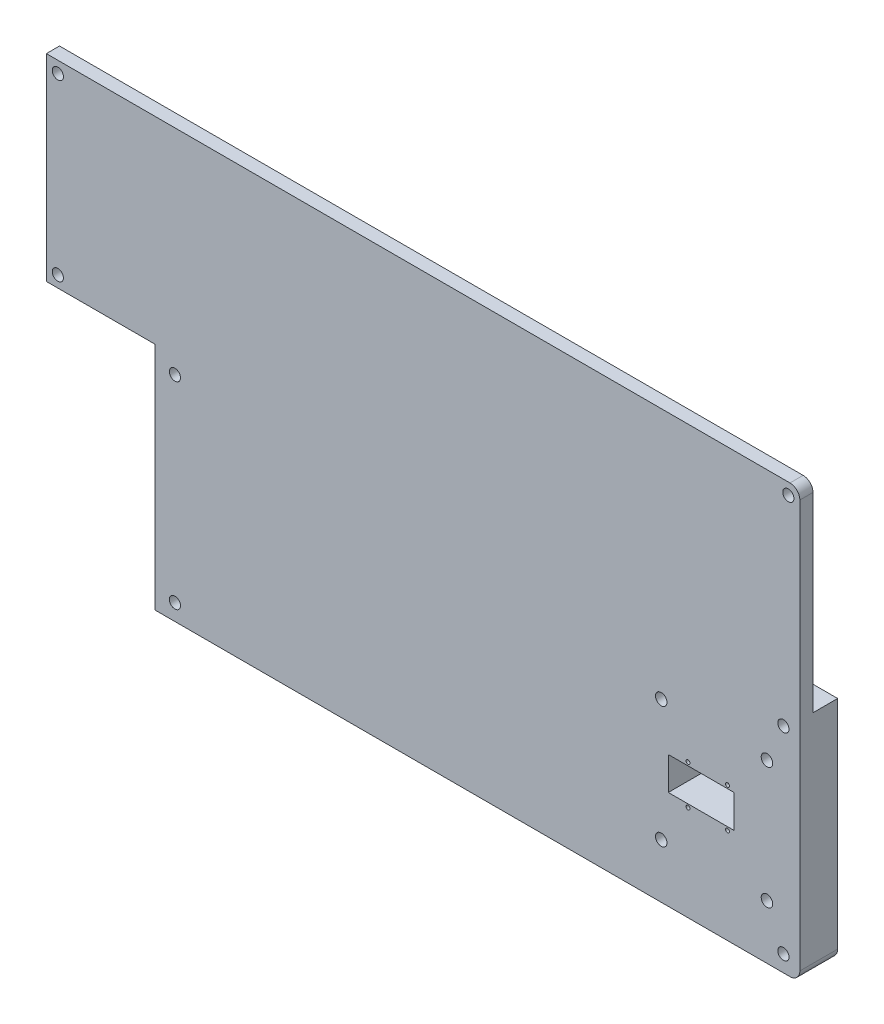
ISO-10303-21;
HEADER;
FILE_DESCRIPTION(('STEP AP214'),'2;1');
FILE_NAME('part.step','',(''),(''),'','','');
FILE_SCHEMA(('AUTOMOTIVE_DESIGN { 1 0 10303 214 1 1 1 1 }'));
ENDSEC;
DATA;
#1=APPLICATION_CONTEXT('core data for automotive mechanical design processes');
#2=APPLICATION_PROTOCOL_DEFINITION('international standard','automotive_design',2000,#1);
#3=PRODUCT_CONTEXT('',#1,'mechanical');
#4=PRODUCT('Part','Part','',(#3));
#5=PRODUCT_RELATED_PRODUCT_CATEGORY('part','',(#4));
#6=PRODUCT_DEFINITION_FORMATION('','',#4);
#7=PRODUCT_DEFINITION_CONTEXT('part definition',#1,'design');
#8=PRODUCT_DEFINITION('design','',#6,#7);
#9=PRODUCT_DEFINITION_SHAPE('','',#8);
#10=(LENGTH_UNIT() NAMED_UNIT(*) SI_UNIT(.MILLI.,.METRE.));
#11=(NAMED_UNIT(*) PLANE_ANGLE_UNIT() SI_UNIT($,.RADIAN.));
#12=(NAMED_UNIT(*) SI_UNIT($,.STERADIAN.) SOLID_ANGLE_UNIT());
#13=UNCERTAINTY_MEASURE_WITH_UNIT(LENGTH_MEASURE(1.E-05),#10,'distance_accuracy_value','');
#14=(GEOMETRIC_REPRESENTATION_CONTEXT(3) GLOBAL_UNCERTAINTY_ASSIGNED_CONTEXT((#13)) GLOBAL_UNIT_ASSIGNED_CONTEXT((#10,
#11,#12)) REPRESENTATION_CONTEXT('',''));
#15=CARTESIAN_POINT('',(0.,0.,0.));
#16=DIRECTION('',(0.,0.,1.));
#17=DIRECTION('',(1.,0.,0.));
#18=AXIS2_PLACEMENT_3D('',#15,#16,#17);
#19=CARTESIAN_POINT('',(0.,0.,4.));
#20=DIRECTION('',(1.,0.,0.));
#21=DIRECTION('',(0.,0.,-1.));
#22=AXIS2_PLACEMENT_3D('',#19,#20,#21);
#23=PLANE('',#22);
#24=DIRECTION('',(0.,0.,1.));
#25=VECTOR('',#24,1.);
#26=CARTESIAN_POINT('',(0.,70.,4.00000000000001));
#27=LINE('',#26,#25);
#28=CARTESIAN_POINT('',(0.,70.,0.));
#29=VERTEX_POINT('',#28);
#30=CARTESIAN_POINT('',(0.,70.,4.00000000000001));
#31=VERTEX_POINT('',#30);
#32=EDGE_CURVE('E219',#29,#31,#27,.T.);
#33=ORIENTED_EDGE('',*,*,#32,.F.);
#34=DIRECTION('',(0.,-1.,0.));
#35=VECTOR('',#34,1.);
#36=CARTESIAN_POINT('',(0.,0.,0.));
#37=LINE('',#36,#35);
#38=CARTESIAN_POINT('',(0.,69.,0.));
#39=VERTEX_POINT('',#38);
#40=EDGE_CURVE('E252',#29,#39,#37,.T.);
#41=ORIENTED_EDGE('',*,*,#40,.T.);
#42=DIRECTION('',(0.,0.,1.));
#43=VECTOR('',#42,1.);
#44=CARTESIAN_POINT('',(0.,69.,-7.5));
#45=LINE('',#44,#43);
#46=CARTESIAN_POINT('',(0.,69.,-7.5));
#47=VERTEX_POINT('',#46);
#48=EDGE_CURVE('E249',#47,#39,#45,.T.);
#49=ORIENTED_EDGE('',*,*,#48,.F.);
#50=DIRECTION('',(0.,1.,0.));
#51=VECTOR('',#50,1.);
#52=CARTESIAN_POINT('',(0.,0.,-7.5));
#53=LINE('',#52,#51);
#54=CARTESIAN_POINT('',(0.,0.,-7.5));
#55=VERTEX_POINT('',#54);
#56=EDGE_CURVE('E240',#55,#47,#53,.T.);
#57=ORIENTED_EDGE('',*,*,#56,.F.);
#58=DIRECTION('',(0.,0.,-1.));
#59=VECTOR('',#58,1.);
#60=CARTESIAN_POINT('',(0.,0.,4.));
#61=LINE('',#60,#59);
#62=CARTESIAN_POINT('',(0.,0.,4.));
#63=VERTEX_POINT('',#62);
#64=EDGE_CURVE('E264',#63,#55,#61,.T.);
#65=ORIENTED_EDGE('',*,*,#64,.F.);
#66=DIRECTION('',(0.,-1.,0.));
#67=VECTOR('',#66,1.);
#68=CARTESIAN_POINT('',(0.,0.,4.));
#69=LINE('',#68,#67);
#70=EDGE_CURVE('E253',#31,#63,#69,.T.);
#71=ORIENTED_EDGE('',*,*,#70,.F.);
#72=EDGE_LOOP('',(#33,#41,#49,#57,#65,#71));
#73=FACE_BOUND('',#72,.T.);
#74=ADVANCED_FACE('F37',(#73),#23,.F.);
#75=CARTESIAN_POINT('',(0.,0.,4.));
#76=DIRECTION('',(0.,1.,0.));
#77=DIRECTION('',(0.,0.,1.));
#78=AXIS2_PLACEMENT_3D('',#75,#76,#77);
#79=PLANE('',#78);
#80=DIRECTION('',(-1.,0.,0.));
#81=VECTOR('',#80,1.);
#82=CARTESIAN_POINT('',(196.,0.,-7.5));
#83=LINE('',#82,#81);
#84=CARTESIAN_POINT('',(193.,0.,-7.5));
#85=VERTEX_POINT('',#84);
#86=EDGE_CURVE('E238',#85,#55,#83,.T.);
#87=ORIENTED_EDGE('',*,*,#86,.F.);
#88=DIRECTION('',(0.,0.,-1.));
#89=VECTOR('',#88,1.);
#90=CARTESIAN_POINT('',(193.,0.,4.));
#91=LINE('',#90,#89);
#92=CARTESIAN_POINT('',(193.,0.,4.));
#93=VERTEX_POINT('',#92);
#94=EDGE_CURVE('E285',#85,#93,#91,.F.);
#95=ORIENTED_EDGE('',*,*,#94,.T.);
#96=DIRECTION('',(1.,0.,0.));
#97=VECTOR('',#96,1.);
#98=CARTESIAN_POINT('',(0.,0.,4.));
#99=LINE('',#98,#97);
#100=EDGE_CURVE('E255',#63,#93,#99,.T.);
#101=ORIENTED_EDGE('',*,*,#100,.F.);
#102=ORIENTED_EDGE('',*,*,#64,.T.);
#103=EDGE_LOOP('',(#87,#95,#101,#102));
#104=FACE_BOUND('',#103,.T.);
#105=ADVANCED_FACE('F419',(#104),#79,.F.);
#106=CARTESIAN_POINT('',(196.,0.,4.));
#107=DIRECTION('',(-1.,0.,0.));
#108=DIRECTION('',(0.,0.,1.));
#109=AXIS2_PLACEMENT_3D('',#106,#107,#108);
#110=PLANE('',#109);
#111=DIRECTION('',(0.,1.,0.));
#112=VECTOR('',#111,1.);
#113=CARTESIAN_POINT('',(196.,0.,4.));
#114=LINE('',#113,#112);
#115=CARTESIAN_POINT('',(196.,3.,4.));
#116=VERTEX_POINT('',#115);
#117=CARTESIAN_POINT('',(196.,127.,4.));
#118=VERTEX_POINT('',#117);
#119=EDGE_CURVE('E259',#116,#118,#114,.T.);
#120=ORIENTED_EDGE('',*,*,#119,.F.);
#121=DIRECTION('',(0.,0.,-1.));
#122=VECTOR('',#121,1.);
#123=CARTESIAN_POINT('',(196.,3.,4.));
#124=LINE('',#123,#122);
#125=CARTESIAN_POINT('',(196.,3.,-7.5));
#126=VERTEX_POINT('',#125);
#127=EDGE_CURVE('E280',#116,#126,#124,.T.);
#128=ORIENTED_EDGE('',*,*,#127,.T.);
#129=DIRECTION('',(0.,-1.,0.));
#130=VECTOR('',#129,1.);
#131=CARTESIAN_POINT('',(196.,0.,-7.5));
#132=LINE('',#131,#130);
#133=CARTESIAN_POINT('',(196.,69.,-7.5));
#134=VERTEX_POINT('',#133);
#135=EDGE_CURVE('E235',#134,#126,#132,.T.);
#136=ORIENTED_EDGE('',*,*,#135,.F.);
#137=DIRECTION('',(0.,0.,1.));
#138=VECTOR('',#137,1.);
#139=CARTESIAN_POINT('',(196.,69.,-7.5));
#140=LINE('',#139,#138);
#141=CARTESIAN_POINT('',(196.,69.,0.));
#142=VERTEX_POINT('',#141);
#143=EDGE_CURVE('E244',#134,#142,#140,.T.);
#144=ORIENTED_EDGE('',*,*,#143,.T.);
#145=DIRECTION('',(0.,1.,0.));
#146=VECTOR('',#145,1.);
#147=CARTESIAN_POINT('',(196.,0.,0.));
#148=LINE('',#147,#146);
#149=CARTESIAN_POINT('',(196.,127.,0.));
#150=VERTEX_POINT('',#149);
#151=EDGE_CURVE('E266',#142,#150,#148,.T.);
#152=ORIENTED_EDGE('',*,*,#151,.T.);
#153=DIRECTION('',(0.,0.,-1.));
#154=VECTOR('',#153,1.);
#155=CARTESIAN_POINT('',(196.,127.,4.));
#156=LINE('',#155,#154);
#157=EDGE_CURVE('E272',#150,#118,#156,.F.);
#158=ORIENTED_EDGE('',*,*,#157,.T.);
#159=EDGE_LOOP('',(#120,#128,#136,#144,#152,#158));
#160=FACE_BOUND('',#159,.T.);
#161=ADVANCED_FACE('F389',(#160),#110,.F.);
#162=CARTESIAN_POINT('',(0.,130.,4.));
#163=DIRECTION('',(0.,-1.,0.));
#164=DIRECTION('',(0.,0.,-1.));
#165=AXIS2_PLACEMENT_3D('',#162,#163,#164);
#166=PLANE('',#165);
#167=DIRECTION('',(-1.,0.,0.));
#168=VECTOR('',#167,1.);
#169=CARTESIAN_POINT('',(0.,130.,4.));
#170=LINE('',#169,#168);
#171=CARTESIAN_POINT('',(193.,130.,4.));
#172=VERTEX_POINT('',#171);
#173=CARTESIAN_POINT('',(-33.1,130.,4.));
#174=VERTEX_POINT('',#173);
#175=EDGE_CURVE('E262',#172,#174,#170,.T.);
#176=ORIENTED_EDGE('',*,*,#175,.F.);
#177=DIRECTION('',(0.,0.,-1.));
#178=VECTOR('',#177,1.);
#179=CARTESIAN_POINT('',(193.,130.,4.));
#180=LINE('',#179,#178);
#181=CARTESIAN_POINT('',(193.,130.,0.));
#182=VERTEX_POINT('',#181);
#183=EDGE_CURVE('E46',#172,#182,#180,.T.);
#184=ORIENTED_EDGE('',*,*,#183,.T.);
#185=DIRECTION('',(-1.,0.,0.));
#186=VECTOR('',#185,1.);
#187=CARTESIAN_POINT('',(0.,130.,0.));
#188=LINE('',#187,#186);
#189=CARTESIAN_POINT('',(-33.1,130.,0.));
#190=VERTEX_POINT('',#189);
#191=EDGE_CURVE('E256',#182,#190,#188,.T.);
#192=ORIENTED_EDGE('',*,*,#191,.T.);
#193=DIRECTION('',(0.,0.,-1.));
#194=VECTOR('',#193,1.);
#195=CARTESIAN_POINT('',(-33.1,130.,4.));
#196=LINE('',#195,#194);
#197=EDGE_CURVE('E218',#174,#190,#196,.T.);
#198=ORIENTED_EDGE('',*,*,#197,.F.);
#199=EDGE_LOOP('',(#176,#184,#192,#198));
#200=FACE_BOUND('',#199,.T.);
#201=ADVANCED_FACE('F350',(#200),#166,.F.);
#202=CARTESIAN_POINT('',(0.,0.,4.));
#203=DIRECTION('',(0.,0.,-1.));
#204=DIRECTION('',(-1.,0.,0.));
#205=AXIS2_PLACEMENT_3D('',#202,#203,#204);
#206=PLANE('',#205);
#207=CARTESIAN_POINT('',(186.,16.5,4.));
#208=DIRECTION('',(0.,0.,1.));
#209=DIRECTION('',(1.,0.,0.));
#210=AXIS2_PLACEMENT_3D('',#207,#208,#209);
#211=CIRCLE('',#210,1.75000000000001);
#212=CARTESIAN_POINT('',(187.75,16.5,4.));
#213=VERTEX_POINT('',#212);
#214=EDGE_CURVE('E334',#213,#213,#211,.T.);
#215=ORIENTED_EDGE('',*,*,#214,.F.);
#216=EDGE_LOOP('',(#215));
#217=FACE_BOUND('',#216,.T.);
#218=CARTESIAN_POINT('',(153.85,16.5,4.));
#219=DIRECTION('',(0.,0.,1.));
#220=DIRECTION('',(1.,0.,0.));
#221=AXIS2_PLACEMENT_3D('',#218,#219,#220);
#222=CIRCLE('',#221,1.75000000000001);
#223=CARTESIAN_POINT('',(155.6,16.5,4.));
#224=VERTEX_POINT('',#223);
#225=EDGE_CURVE('E337',#224,#224,#222,.T.);
#226=ORIENTED_EDGE('',*,*,#225,.F.);
#227=EDGE_LOOP('',(#226));
#228=FACE_BOUND('',#227,.T.);
#229=CARTESIAN_POINT('',(153.85,53.5,4.));
#230=DIRECTION('',(0.,0.,1.));
#231=DIRECTION('',(1.,0.,0.));
#232=AXIS2_PLACEMENT_3D('',#229,#230,#231);
#233=CIRCLE('',#232,1.75000000000001);
#234=CARTESIAN_POINT('',(155.6,53.5,4.));
#235=VERTEX_POINT('',#234);
#236=EDGE_CURVE('E333',#235,#235,#233,.T.);
#237=ORIENTED_EDGE('',*,*,#236,.F.);
#238=EDGE_LOOP('',(#237));
#239=FACE_BOUND('',#238,.T.);
#240=CARTESIAN_POINT('',(186.,53.5,4.));
#241=DIRECTION('',(0.,0.,1.));
#242=DIRECTION('',(1.,0.,0.));
#243=AXIS2_PLACEMENT_3D('',#240,#241,#242);
#244=CIRCLE('',#243,1.75000000000001);
#245=CARTESIAN_POINT('',(187.75,53.5,4.));
#246=VERTEX_POINT('',#245);
#247=EDGE_CURVE('E297',#246,#246,#244,.T.);
#248=ORIENTED_EDGE('',*,*,#247,.F.);
#249=EDGE_LOOP('',(#248));
#250=FACE_BOUND('',#249,.T.);
#251=CARTESIAN_POINT('',(162.,29.,4.));
#252=DIRECTION('',(0.,0.,1.));
#253=DIRECTION('',(1.,0.,0.));
#254=AXIS2_PLACEMENT_3D('',#251,#252,#253);
#255=CIRCLE('',#254,0.599999999999992);
#256=CARTESIAN_POINT('',(162.6,29.,4.));
#257=VERTEX_POINT('',#256);
#258=EDGE_CURVE('E307',#257,#257,#255,.T.);
#259=ORIENTED_EDGE('',*,*,#258,.F.);
#260=EDGE_LOOP('',(#259));
#261=FACE_BOUND('',#260,.T.);
#262=CARTESIAN_POINT('',(174.,29.,4.));
#263=DIRECTION('',(0.,0.,1.));
#264=DIRECTION('',(1.,0.,0.));
#265=AXIS2_PLACEMENT_3D('',#262,#263,#264);
#266=CIRCLE('',#265,0.599999999999992);
#267=CARTESIAN_POINT('',(174.6,29.,4.));
#268=VERTEX_POINT('',#267);
#269=EDGE_CURVE('E315',#268,#268,#266,.T.);
#270=ORIENTED_EDGE('',*,*,#269,.F.);
#271=EDGE_LOOP('',(#270));
#272=FACE_BOUND('',#271,.T.);
#273=CARTESIAN_POINT('',(162.,41.,4.));
#274=DIRECTION('',(0.,0.,1.));
#275=DIRECTION('',(1.,0.,0.));
#276=AXIS2_PLACEMENT_3D('',#273,#274,#275);
#277=CIRCLE('',#276,0.599999999999992);
#278=CARTESIAN_POINT('',(162.6,41.,4.));
#279=VERTEX_POINT('',#278);
#280=EDGE_CURVE('E323',#279,#279,#277,.T.);
#281=ORIENTED_EDGE('',*,*,#280,.F.);
#282=EDGE_LOOP('',(#281));
#283=FACE_BOUND('',#282,.T.);
#284=CARTESIAN_POINT('',(174.,41.,4.));
#285=DIRECTION('',(0.,0.,1.));
#286=DIRECTION('',(1.,0.,0.));
#287=AXIS2_PLACEMENT_3D('',#284,#285,#286);
#288=CIRCLE('',#287,0.599999999999992);
#289=CARTESIAN_POINT('',(174.6,41.,4.));
#290=VERTEX_POINT('',#289);
#291=EDGE_CURVE('E170',#290,#290,#288,.T.);
#292=ORIENTED_EDGE('',*,*,#291,.F.);
#293=EDGE_LOOP('',(#292));
#294=FACE_BOUND('',#293,.T.);
#295=DIRECTION('',(-1.,0.,0.));
#296=VECTOR('',#295,1.);
#297=CARTESIAN_POINT('',(176.,40.,4.));
#298=LINE('',#297,#296);
#299=CARTESIAN_POINT('',(176.,40.,4.));
#300=VERTEX_POINT('',#299);
#301=CARTESIAN_POINT('',(156.,40.,4.));
#302=VERTEX_POINT('',#301);
#303=EDGE_CURVE('E169',#300,#302,#298,.T.);
#304=ORIENTED_EDGE('',*,*,#303,.F.);
#305=DIRECTION('',(0.,1.,0.));
#306=VECTOR('',#305,1.);
#307=CARTESIAN_POINT('',(176.,30.,4.));
#308=LINE('',#307,#306);
#309=CARTESIAN_POINT('',(176.,30.,4.));
#310=VERTEX_POINT('',#309);
#311=EDGE_CURVE('E54',#310,#300,#308,.T.);
#312=ORIENTED_EDGE('',*,*,#311,.F.);
#313=DIRECTION('',(1.,0.,0.));
#314=VECTOR('',#313,1.);
#315=CARTESIAN_POINT('',(176.,30.,4.));
#316=LINE('',#315,#314);
#317=CARTESIAN_POINT('',(156.,30.,4.));
#318=VERTEX_POINT('',#317);
#319=EDGE_CURVE('E157',#318,#310,#316,.T.);
#320=ORIENTED_EDGE('',*,*,#319,.F.);
#321=DIRECTION('',(0.,-1.,0.));
#322=VECTOR('',#321,1.);
#323=CARTESIAN_POINT('',(156.,30.,4.));
#324=LINE('',#323,#322);
#325=EDGE_CURVE('E160',#302,#318,#324,.T.);
#326=ORIENTED_EDGE('',*,*,#325,.F.);
#327=EDGE_LOOP('',(#304,#312,#320,#326));
#328=FACE_BOUND('',#327,.T.);
#329=CARTESIAN_POINT('',(-29.6,126.5,4.));
#330=DIRECTION('',(0.,0.,1.));
#331=DIRECTION('',(1.,0.,0.));
#332=AXIS2_PLACEMENT_3D('',#329,#330,#331);
#333=CIRCLE('',#332,1.7);
#334=CARTESIAN_POINT('',(-27.9,126.5,4.));
#335=VERTEX_POINT('',#334);
#336=EDGE_CURVE('E180',#335,#335,#333,.T.);
#337=ORIENTED_EDGE('',*,*,#336,.F.);
#338=EDGE_LOOP('',(#337));
#339=FACE_BOUND('',#338,.T.);
#340=CARTESIAN_POINT('',(-29.6,73.5,4.));
#341=DIRECTION('',(0.,0.,1.));
#342=DIRECTION('',(1.,0.,0.));
#343=AXIS2_PLACEMENT_3D('',#340,#341,#342);
#344=CIRCLE('',#343,1.7);
#345=CARTESIAN_POINT('',(-27.9,73.5,4.));
#346=VERTEX_POINT('',#345);
#347=EDGE_CURVE('E176',#346,#346,#344,.T.);
#348=ORIENTED_EDGE('',*,*,#347,.F.);
#349=EDGE_LOOP('',(#348));
#350=FACE_BOUND('',#349,.T.);
#351=CARTESIAN_POINT('',(6.00000000000001,65.,4.));
#352=DIRECTION('',(0.,0.,1.));
#353=DIRECTION('',(1.,0.,0.));
#354=AXIS2_PLACEMENT_3D('',#351,#352,#353);
#355=CIRCLE('',#354,1.7);
#356=CARTESIAN_POINT('',(7.70000000000001,65.,4.));
#357=VERTEX_POINT('',#356);
#358=EDGE_CURVE('E202',#357,#357,#355,.T.);
#359=ORIENTED_EDGE('',*,*,#358,.F.);
#360=EDGE_LOOP('',(#359));
#361=FACE_BOUND('',#360,.T.);
#362=CARTESIAN_POINT('',(6.00000000000001,5.,4.));
#363=DIRECTION('',(0.,0.,1.));
#364=DIRECTION('',(1.,0.,0.));
#365=AXIS2_PLACEMENT_3D('',#362,#363,#364);
#366=CIRCLE('',#365,1.7);
#367=CARTESIAN_POINT('',(7.70000000000001,5.,4.));
#368=VERTEX_POINT('',#367);
#369=EDGE_CURVE('E196',#368,#368,#366,.T.);
#370=ORIENTED_EDGE('',*,*,#369,.F.);
#371=EDGE_LOOP('',(#370));
#372=FACE_BOUND('',#371,.T.);
#373=CARTESIAN_POINT('',(191.,65.,4.));
#374=DIRECTION('',(0.,0.,1.));
#375=DIRECTION('',(1.,0.,0.));
#376=AXIS2_PLACEMENT_3D('',#373,#374,#375);
#377=CIRCLE('',#376,1.70000000000001);
#378=CARTESIAN_POINT('',(192.7,65.,4.));
#379=VERTEX_POINT('',#378);
#380=EDGE_CURVE('E190',#379,#379,#377,.T.);
#381=ORIENTED_EDGE('',*,*,#380,.F.);
#382=EDGE_LOOP('',(#381));
#383=FACE_BOUND('',#382,.T.);
#384=CARTESIAN_POINT('',(192.5,126.5,4.));
#385=DIRECTION('',(0.,0.,1.));
#386=DIRECTION('',(1.,0.,0.));
#387=AXIS2_PLACEMENT_3D('',#384,#385,#386);
#388=CIRCLE('',#387,1.70000000000001);
#389=CARTESIAN_POINT('',(194.2,126.5,4.));
#390=VERTEX_POINT('',#389);
#391=EDGE_CURVE('E186',#390,#390,#388,.T.);
#392=ORIENTED_EDGE('',*,*,#391,.F.);
#393=EDGE_LOOP('',(#392));
#394=FACE_BOUND('',#393,.T.);
#395=CARTESIAN_POINT('',(191.,5.,4.));
#396=DIRECTION('',(0.,0.,1.));
#397=DIRECTION('',(1.,0.,0.));
#398=AXIS2_PLACEMENT_3D('',#395,#396,#397);
#399=CIRCLE('',#398,1.70000000000001);
#400=CARTESIAN_POINT('',(192.7,5.,4.));
#401=VERTEX_POINT('',#400);
#402=EDGE_CURVE('E189',#401,#401,#399,.T.);
#403=ORIENTED_EDGE('',*,*,#402,.F.);
#404=EDGE_LOOP('',(#403));
#405=FACE_BOUND('',#404,.T.);
#406=ORIENTED_EDGE('',*,*,#100,.T.);
#407=CARTESIAN_POINT('',(193.,3.,4.));
#408=DIRECTION('',(0.,0.,-1.));
#409=DIRECTION('',(-1.,0.,0.));
#410=AXIS2_PLACEMENT_3D('',#407,#408,#409);
#411=CIRCLE('',#410,3.);
#412=EDGE_CURVE('E289',#93,#116,#411,.F.);
#413=ORIENTED_EDGE('',*,*,#412,.T.);
#414=ORIENTED_EDGE('',*,*,#119,.T.);
#415=CARTESIAN_POINT('',(193.,127.,4.));
#416=DIRECTION('',(0.,0.,-1.));
#417=DIRECTION('',(-1.,0.,0.));
#418=AXIS2_PLACEMENT_3D('',#415,#416,#417);
#419=CIRCLE('',#418,3.);
#420=EDGE_CURVE('E287',#118,#172,#419,.F.);
#421=ORIENTED_EDGE('',*,*,#420,.T.);
#422=ORIENTED_EDGE('',*,*,#175,.T.);
#423=DIRECTION('',(0.,1.,0.));
#424=VECTOR('',#423,1.);
#425=CARTESIAN_POINT('',(-33.1,130.,4.));
#426=LINE('',#425,#424);
#427=CARTESIAN_POINT('',(-33.1,70.,4.00000000000001));
#428=VERTEX_POINT('',#427);
#429=EDGE_CURVE('E215',#428,#174,#426,.T.);
#430=ORIENTED_EDGE('',*,*,#429,.F.);
#431=DIRECTION('',(1.,0.,0.));
#432=VECTOR('',#431,1.);
#433=CARTESIAN_POINT('',(-33.1,70.,4.00000000000001));
#434=LINE('',#433,#432);
#435=EDGE_CURVE('E226',#428,#31,#434,.T.);
#436=ORIENTED_EDGE('',*,*,#435,.T.);
#437=ORIENTED_EDGE('',*,*,#70,.T.);
#438=EDGE_LOOP('',(#406,#413,#414,#421,#422,#430,#436,#437));
#439=FACE_BOUND('',#438,.T.);
#440=ADVANCED_FACE('F346',(#217,#228,#239,#250,#261,#272,#283,#294,#328,#339,#350,#361,#372,
#383,#394,#405,#439),#206,.F.);
#441=CARTESIAN_POINT('',(0.,0.,0.));
#442=DIRECTION('',(0.,0.,-1.));
#443=DIRECTION('',(-1.,0.,0.));
#444=AXIS2_PLACEMENT_3D('',#441,#442,#443);
#445=PLANE('',#444);
#446=CARTESIAN_POINT('',(-29.6,126.5,0.));
#447=DIRECTION('',(0.,0.,-1.));
#448=DIRECTION('',(-1.,0.,0.));
#449=AXIS2_PLACEMENT_3D('',#446,#447,#448);
#450=CIRCLE('',#449,1.7);
#451=CARTESIAN_POINT('',(-31.3,126.5,0.));
#452=VERTEX_POINT('',#451);
#453=EDGE_CURVE('E208',#452,#452,#450,.T.);
#454=ORIENTED_EDGE('',*,*,#453,.F.);
#455=EDGE_LOOP('',(#454));
#456=FACE_BOUND('',#455,.T.);
#457=CARTESIAN_POINT('',(-29.6,73.5,0.));
#458=DIRECTION('',(0.,0.,-1.));
#459=DIRECTION('',(-1.,0.,0.));
#460=AXIS2_PLACEMENT_3D('',#457,#458,#459);
#461=CIRCLE('',#460,1.7);
#462=CARTESIAN_POINT('',(-31.3,73.5,0.));
#463=VERTEX_POINT('',#462);
#464=EDGE_CURVE('E183',#463,#463,#461,.T.);
#465=ORIENTED_EDGE('',*,*,#464,.F.);
#466=EDGE_LOOP('',(#465));
#467=FACE_BOUND('',#466,.T.);
#468=CARTESIAN_POINT('',(192.5,126.5,0.));
#469=DIRECTION('',(0.,0.,-1.));
#470=DIRECTION('',(-1.,0.,0.));
#471=AXIS2_PLACEMENT_3D('',#468,#469,#470);
#472=CIRCLE('',#471,1.70000000000001);
#473=CARTESIAN_POINT('',(190.8,126.5,0.));
#474=VERTEX_POINT('',#473);
#475=EDGE_CURVE('E212',#474,#474,#472,.T.);
#476=ORIENTED_EDGE('',*,*,#475,.F.);
#477=EDGE_LOOP('',(#476));
#478=FACE_BOUND('',#477,.T.);
#479=ORIENTED_EDGE('',*,*,#191,.F.);
#480=CARTESIAN_POINT('',(193.,127.,0.));
#481=DIRECTION('',(0.,0.,-1.));
#482=DIRECTION('',(-1.,0.,0.));
#483=AXIS2_PLACEMENT_3D('',#480,#481,#482);
#484=CIRCLE('',#483,3.);
#485=EDGE_CURVE('E11',#182,#150,#484,.T.);
#486=ORIENTED_EDGE('',*,*,#485,.T.);
#487=ORIENTED_EDGE('',*,*,#151,.F.);
#488=DIRECTION('',(1.,0.,0.));
#489=VECTOR('',#488,1.);
#490=CARTESIAN_POINT('',(196.,69.,0.));
#491=LINE('',#490,#489);
#492=EDGE_CURVE('E234',#39,#142,#491,.T.);
#493=ORIENTED_EDGE('',*,*,#492,.F.);
#494=ORIENTED_EDGE('',*,*,#40,.F.);
#495=DIRECTION('',(1.,0.,0.));
#496=VECTOR('',#495,1.);
#497=CARTESIAN_POINT('',(-33.1,70.,0.));
#498=LINE('',#497,#496);
#499=CARTESIAN_POINT('',(-33.1,70.,0.));
#500=VERTEX_POINT('',#499);
#501=EDGE_CURVE('E231',#500,#29,#498,.T.);
#502=ORIENTED_EDGE('',*,*,#501,.F.);
#503=DIRECTION('',(0.,-1.,0.));
#504=VECTOR('',#503,1.);
#505=CARTESIAN_POINT('',(-33.1,130.,0.));
#506=LINE('',#505,#504);
#507=EDGE_CURVE('E222',#190,#500,#506,.T.);
#508=ORIENTED_EDGE('',*,*,#507,.F.);
#509=EDGE_LOOP('',(#479,#486,#487,#493,#494,#502,#508));
#510=FACE_BOUND('',#509,.T.);
#511=ADVANCED_FACE('F349',(#456,#467,#478,#510),#445,.T.);
#512=CARTESIAN_POINT('',(196.,69.,-7.5));
#513=DIRECTION('',(0.,-1.,0.));
#514=DIRECTION('',(0.,0.,-1.));
#515=AXIS2_PLACEMENT_3D('',#512,#513,#514);
#516=PLANE('',#515);
#517=ORIENTED_EDGE('',*,*,#492,.T.);
#518=ORIENTED_EDGE('',*,*,#143,.F.);
#519=DIRECTION('',(1.,0.,0.));
#520=VECTOR('',#519,1.);
#521=CARTESIAN_POINT('',(196.,69.,-7.5));
#522=LINE('',#521,#520);
#523=EDGE_CURVE('E242',#47,#134,#522,.T.);
#524=ORIENTED_EDGE('',*,*,#523,.F.);
#525=ORIENTED_EDGE('',*,*,#48,.T.);
#526=EDGE_LOOP('',(#517,#518,#524,#525));
#527=FACE_BOUND('',#526,.T.);
#528=ADVANCED_FACE('F397',(#527),#516,.F.);
#529=CARTESIAN_POINT('',(0.,0.,-7.5));
#530=DIRECTION('',(0.,0.,1.));
#531=DIRECTION('',(1.,0.,0.));
#532=AXIS2_PLACEMENT_3D('',#529,#530,#531);
#533=PLANE('',#532);
#534=CARTESIAN_POINT('',(186.,16.5,-7.5));
#535=DIRECTION('',(0.,0.,1.));
#536=DIRECTION('',(1.,0.,0.));
#537=AXIS2_PLACEMENT_3D('',#534,#535,#536);
#538=CIRCLE('',#537,1.75000000000001);
#539=CARTESIAN_POINT('',(187.75,16.5,-7.5));
#540=VERTEX_POINT('',#539);
#541=EDGE_CURVE('E41',#540,#540,#538,.T.);
#542=ORIENTED_EDGE('',*,*,#541,.T.);
#543=EDGE_LOOP('',(#542));
#544=FACE_BOUND('',#543,.T.);
#545=CARTESIAN_POINT('',(153.85,16.5,-7.5));
#546=DIRECTION('',(0.,0.,1.));
#547=DIRECTION('',(1.,0.,0.));
#548=AXIS2_PLACEMENT_3D('',#545,#546,#547);
#549=CIRCLE('',#548,1.75000000000001);
#550=CARTESIAN_POINT('',(155.6,16.5,-7.5));
#551=VERTEX_POINT('',#550);
#552=EDGE_CURVE('E299',#551,#551,#549,.T.);
#553=ORIENTED_EDGE('',*,*,#552,.T.);
#554=EDGE_LOOP('',(#553));
#555=FACE_BOUND('',#554,.T.);
#556=CARTESIAN_POINT('',(153.85,53.5,-7.5));
#557=DIRECTION('',(0.,0.,1.));
#558=DIRECTION('',(1.,0.,0.));
#559=AXIS2_PLACEMENT_3D('',#556,#557,#558);
#560=CIRCLE('',#559,1.75000000000001);
#561=CARTESIAN_POINT('',(155.6,53.5,-7.5));
#562=VERTEX_POINT('',#561);
#563=EDGE_CURVE('E296',#562,#562,#560,.T.);
#564=ORIENTED_EDGE('',*,*,#563,.T.);
#565=EDGE_LOOP('',(#564));
#566=FACE_BOUND('',#565,.T.);
#567=CARTESIAN_POINT('',(186.,53.5,-7.5));
#568=DIRECTION('',(0.,0.,1.));
#569=DIRECTION('',(1.,0.,0.));
#570=AXIS2_PLACEMENT_3D('',#567,#568,#569);
#571=CIRCLE('',#570,1.75000000000001);
#572=CARTESIAN_POINT('',(187.75,53.5,-7.5));
#573=VERTEX_POINT('',#572);
#574=EDGE_CURVE('E293',#573,#573,#571,.T.);
#575=ORIENTED_EDGE('',*,*,#574,.T.);
#576=EDGE_LOOP('',(#575));
#577=FACE_BOUND('',#576,.T.);
#578=CARTESIAN_POINT('',(162.,29.,-7.5));
#579=DIRECTION('',(0.,0.,1.));
#580=DIRECTION('',(1.,0.,0.));
#581=AXIS2_PLACEMENT_3D('',#578,#579,#580);
#582=CIRCLE('',#581,0.599999999999992);
#583=CARTESIAN_POINT('',(162.6,29.,-7.5));
#584=VERTEX_POINT('',#583);
#585=EDGE_CURVE('E163',#584,#584,#582,.T.);
#586=ORIENTED_EDGE('',*,*,#585,.T.);
#587=EDGE_LOOP('',(#586));
#588=FACE_BOUND('',#587,.T.);
#589=CARTESIAN_POINT('',(174.,29.,-7.5));
#590=DIRECTION('',(0.,0.,1.));
#591=DIRECTION('',(1.,0.,0.));
#592=AXIS2_PLACEMENT_3D('',#589,#590,#591);
#593=CIRCLE('',#592,0.599999999999992);
#594=CARTESIAN_POINT('',(174.6,29.,-7.5));
#595=VERTEX_POINT('',#594);
#596=EDGE_CURVE('E311',#595,#595,#593,.T.);
#597=ORIENTED_EDGE('',*,*,#596,.T.);
#598=EDGE_LOOP('',(#597));
#599=FACE_BOUND('',#598,.T.);
#600=CARTESIAN_POINT('',(162.,41.,-7.5));
#601=DIRECTION('',(0.,0.,1.));
#602=DIRECTION('',(1.,0.,0.));
#603=AXIS2_PLACEMENT_3D('',#600,#601,#602);
#604=CIRCLE('',#603,0.599999999999992);
#605=CARTESIAN_POINT('',(162.6,41.,-7.5));
#606=VERTEX_POINT('',#605);
#607=EDGE_CURVE('E320',#606,#606,#604,.T.);
#608=ORIENTED_EDGE('',*,*,#607,.T.);
#609=EDGE_LOOP('',(#608));
#610=FACE_BOUND('',#609,.T.);
#611=CARTESIAN_POINT('',(174.,41.,-7.5));
#612=DIRECTION('',(0.,0.,1.));
#613=DIRECTION('',(1.,0.,0.));
#614=AXIS2_PLACEMENT_3D('',#611,#612,#613);
#615=CIRCLE('',#614,0.599999999999992);
#616=CARTESIAN_POINT('',(174.6,41.,-7.5));
#617=VERTEX_POINT('',#616);
#618=EDGE_CURVE('E326',#617,#617,#615,.T.);
#619=ORIENTED_EDGE('',*,*,#618,.T.);
#620=EDGE_LOOP('',(#619));
#621=FACE_BOUND('',#620,.T.);
#622=DIRECTION('',(1.,0.,0.));
#623=VECTOR('',#622,1.);
#624=CARTESIAN_POINT('',(176.,30.,-7.5));
#625=LINE('',#624,#623);
#626=CARTESIAN_POINT('',(156.,30.,-7.5));
#627=VERTEX_POINT('',#626);
#628=CARTESIAN_POINT('',(176.,30.,-7.5));
#629=VERTEX_POINT('',#628);
#630=EDGE_CURVE('E147',#627,#629,#625,.T.);
#631=ORIENTED_EDGE('',*,*,#630,.T.);
#632=DIRECTION('',(0.,1.,0.));
#633=VECTOR('',#632,1.);
#634=CARTESIAN_POINT('',(176.,30.,-7.5));
#635=LINE('',#634,#633);
#636=CARTESIAN_POINT('',(176.,40.,-7.5));
#637=VERTEX_POINT('',#636);
#638=EDGE_CURVE('E141',#629,#637,#635,.T.);
#639=ORIENTED_EDGE('',*,*,#638,.T.);
#640=DIRECTION('',(-1.,0.,0.));
#641=VECTOR('',#640,1.);
#642=CARTESIAN_POINT('',(176.,40.,-7.5));
#643=LINE('',#642,#641);
#644=CARTESIAN_POINT('',(156.,40.,-7.5));
#645=VERTEX_POINT('',#644);
#646=EDGE_CURVE('E150',#637,#645,#643,.T.);
#647=ORIENTED_EDGE('',*,*,#646,.T.);
#648=DIRECTION('',(0.,-1.,0.));
#649=VECTOR('',#648,1.);
#650=CARTESIAN_POINT('',(156.,30.,-7.5));
#651=LINE('',#650,#649);
#652=EDGE_CURVE('E62',#645,#627,#651,.T.);
#653=ORIENTED_EDGE('',*,*,#652,.T.);
#654=EDGE_LOOP('',(#631,#639,#647,#653));
#655=FACE_BOUND('',#654,.T.);
#656=CARTESIAN_POINT('',(6.00000000000001,65.,-7.5));
#657=DIRECTION('',(0.,0.,1.));
#658=DIRECTION('',(1.,0.,0.));
#659=AXIS2_PLACEMENT_3D('',#656,#657,#658);
#660=CIRCLE('',#659,1.7);
#661=CARTESIAN_POINT('',(7.70000000000001,65.,-7.5));
#662=VERTEX_POINT('',#661);
#663=EDGE_CURVE('E205',#662,#662,#660,.T.);
#664=ORIENTED_EDGE('',*,*,#663,.T.);
#665=EDGE_LOOP('',(#664));
#666=FACE_BOUND('',#665,.T.);
#667=CARTESIAN_POINT('',(6.00000000000001,5.,-7.5));
#668=DIRECTION('',(0.,0.,1.));
#669=DIRECTION('',(1.,0.,0.));
#670=AXIS2_PLACEMENT_3D('',#667,#668,#669);
#671=CIRCLE('',#670,1.7);
#672=CARTESIAN_POINT('',(7.70000000000001,5.,-7.5));
#673=VERTEX_POINT('',#672);
#674=EDGE_CURVE('E199',#673,#673,#671,.T.);
#675=ORIENTED_EDGE('',*,*,#674,.T.);
#676=EDGE_LOOP('',(#675));
#677=FACE_BOUND('',#676,.T.);
#678=CARTESIAN_POINT('',(191.,65.,-7.5));
#679=DIRECTION('',(0.,0.,1.));
#680=DIRECTION('',(1.,0.,0.));
#681=AXIS2_PLACEMENT_3D('',#678,#679,#680);
#682=CIRCLE('',#681,1.70000000000001);
#683=CARTESIAN_POINT('',(192.7,65.,-7.5));
#684=VERTEX_POINT('',#683);
#685=EDGE_CURVE('E193',#684,#684,#682,.T.);
#686=ORIENTED_EDGE('',*,*,#685,.T.);
#687=EDGE_LOOP('',(#686));
#688=FACE_BOUND('',#687,.T.);
#689=CARTESIAN_POINT('',(191.,5.,-7.5));
#690=DIRECTION('',(0.,0.,1.));
#691=DIRECTION('',(1.,0.,0.));
#692=AXIS2_PLACEMENT_3D('',#689,#690,#691);
#693=CIRCLE('',#692,1.70000000000001);
#694=CARTESIAN_POINT('',(192.7,5.,-7.5));
#695=VERTEX_POINT('',#694);
#696=EDGE_CURVE('E209',#695,#695,#693,.T.);
#697=ORIENTED_EDGE('',*,*,#696,.T.);
#698=EDGE_LOOP('',(#697));
#699=FACE_BOUND('',#698,.T.);
#700=ORIENTED_EDGE('',*,*,#135,.T.);
#701=CARTESIAN_POINT('',(193.,3.,-7.5));
#702=DIRECTION('',(0.,0.,1.));
#703=DIRECTION('',(1.,0.,0.));
#704=AXIS2_PLACEMENT_3D('',#701,#702,#703);
#705=CIRCLE('',#704,3.);
#706=EDGE_CURVE('E283',#126,#85,#705,.F.);
#707=ORIENTED_EDGE('',*,*,#706,.T.);
#708=ORIENTED_EDGE('',*,*,#86,.T.);
#709=ORIENTED_EDGE('',*,*,#56,.T.);
#710=ORIENTED_EDGE('',*,*,#523,.T.);
#711=EDGE_LOOP('',(#700,#707,#708,#709,#710));
#712=FACE_BOUND('',#711,.T.);
#713=ADVANCED_FACE('F154',(#544,#555,#566,#577,#588,#599,#610,#621,#655,#666,#677,#688,#699,
#712),#533,.F.);
#714=CARTESIAN_POINT('',(-33.1,70.,4.00000000000001));
#715=DIRECTION('',(0.,1.,0.));
#716=DIRECTION('',(0.,0.,1.));
#717=AXIS2_PLACEMENT_3D('',#714,#715,#716);
#718=PLANE('',#717);
#719=ORIENTED_EDGE('',*,*,#32,.T.);
#720=ORIENTED_EDGE('',*,*,#435,.F.);
#721=DIRECTION('',(0.,0.,1.));
#722=VECTOR('',#721,1.);
#723=CARTESIAN_POINT('',(-33.1,70.,4.00000000000001));
#724=LINE('',#723,#722);
#725=EDGE_CURVE('E224',#500,#428,#724,.T.);
#726=ORIENTED_EDGE('',*,*,#725,.F.);
#727=ORIENTED_EDGE('',*,*,#501,.T.);
#728=EDGE_LOOP('',(#719,#720,#726,#727));
#729=FACE_BOUND('',#728,.T.);
#730=ADVANCED_FACE('F415',(#729),#718,.F.);
#731=CARTESIAN_POINT('',(-33.1,0.,0.));
#732=DIRECTION('',(1.,0.,0.));
#733=DIRECTION('',(0.,0.,-1.));
#734=AXIS2_PLACEMENT_3D('',#731,#732,#733);
#735=PLANE('',#734);
#736=ORIENTED_EDGE('',*,*,#429,.T.);
#737=ORIENTED_EDGE('',*,*,#197,.T.);
#738=ORIENTED_EDGE('',*,*,#507,.T.);
#739=ORIENTED_EDGE('',*,*,#725,.T.);
#740=EDGE_LOOP('',(#736,#737,#738,#739));
#741=FACE_BOUND('',#740,.T.);
#742=ADVANCED_FACE('F411',(#741),#735,.F.);
#743=CARTESIAN_POINT('',(191.,5.,-7.5));
#744=DIRECTION('',(0.,0.,1.));
#745=DIRECTION('',(1.,0.,0.));
#746=AXIS2_PLACEMENT_3D('',#743,#744,#745);
#747=CYLINDRICAL_SURFACE('',#746,1.70000000000001);
#748=ORIENTED_EDGE('',*,*,#696,.F.);
#749=EDGE_LOOP('',(#748));
#750=FACE_BOUND('',#749,.T.);
#751=ORIENTED_EDGE('',*,*,#402,.T.);
#752=EDGE_LOOP('',(#751));
#753=FACE_BOUND('',#752,.T.);
#754=ADVANCED_FACE('F456',(#750,#753),#747,.F.);
#755=CARTESIAN_POINT('',(191.,65.,-7.5));
#756=DIRECTION('',(0.,0.,1.));
#757=DIRECTION('',(1.,0.,0.));
#758=AXIS2_PLACEMENT_3D('',#755,#756,#757);
#759=CYLINDRICAL_SURFACE('',#758,1.70000000000001);
#760=ORIENTED_EDGE('',*,*,#685,.F.);
#761=EDGE_LOOP('',(#760));
#762=FACE_BOUND('',#761,.T.);
#763=ORIENTED_EDGE('',*,*,#380,.T.);
#764=EDGE_LOOP('',(#763));
#765=FACE_BOUND('',#764,.T.);
#766=ADVANCED_FACE('F452',(#762,#765),#759,.F.);
#767=CARTESIAN_POINT('',(6.00000000000001,5.,-7.5));
#768=DIRECTION('',(0.,0.,1.));
#769=DIRECTION('',(1.,0.,0.));
#770=AXIS2_PLACEMENT_3D('',#767,#768,#769);
#771=CYLINDRICAL_SURFACE('',#770,1.7);
#772=ORIENTED_EDGE('',*,*,#674,.F.);
#773=EDGE_LOOP('',(#772));
#774=FACE_BOUND('',#773,.T.);
#775=ORIENTED_EDGE('',*,*,#369,.T.);
#776=EDGE_LOOP('',(#775));
#777=FACE_BOUND('',#776,.T.);
#778=ADVANCED_FACE('F455',(#774,#777),#771,.F.);
#779=CARTESIAN_POINT('',(6.00000000000001,65.,-7.5));
#780=DIRECTION('',(0.,0.,1.));
#781=DIRECTION('',(1.,0.,0.));
#782=AXIS2_PLACEMENT_3D('',#779,#780,#781);
#783=CYLINDRICAL_SURFACE('',#782,1.7);
#784=ORIENTED_EDGE('',*,*,#663,.F.);
#785=EDGE_LOOP('',(#784));
#786=FACE_BOUND('',#785,.T.);
#787=ORIENTED_EDGE('',*,*,#358,.T.);
#788=EDGE_LOOP('',(#787));
#789=FACE_BOUND('',#788,.T.);
#790=ADVANCED_FACE('F450',(#786,#789),#783,.F.);
#791=CARTESIAN_POINT('',(192.5,126.5,-7.5));
#792=DIRECTION('',(0.,0.,1.));
#793=DIRECTION('',(1.,0.,0.));
#794=AXIS2_PLACEMENT_3D('',#791,#792,#793);
#795=CYLINDRICAL_SURFACE('',#794,1.70000000000001);
#796=ORIENTED_EDGE('',*,*,#475,.T.);
#797=EDGE_LOOP('',(#796));
#798=FACE_BOUND('',#797,.T.);
#799=ORIENTED_EDGE('',*,*,#391,.T.);
#800=EDGE_LOOP('',(#799));
#801=FACE_BOUND('',#800,.T.);
#802=ADVANCED_FACE('F441',(#798,#801),#795,.F.);
#803=CARTESIAN_POINT('',(-29.6,73.5,-7.5));
#804=DIRECTION('',(0.,0.,1.));
#805=DIRECTION('',(1.,0.,0.));
#806=AXIS2_PLACEMENT_3D('',#803,#804,#805);
#807=CYLINDRICAL_SURFACE('',#806,1.7);
#808=ORIENTED_EDGE('',*,*,#464,.T.);
#809=EDGE_LOOP('',(#808));
#810=FACE_BOUND('',#809,.T.);
#811=ORIENTED_EDGE('',*,*,#347,.T.);
#812=EDGE_LOOP('',(#811));
#813=FACE_BOUND('',#812,.T.);
#814=ADVANCED_FACE('F435',(#810,#813),#807,.F.);
#815=CARTESIAN_POINT('',(-29.6,126.5,-7.5));
#816=DIRECTION('',(0.,0.,1.));
#817=DIRECTION('',(1.,0.,0.));
#818=AXIS2_PLACEMENT_3D('',#815,#816,#817);
#819=CYLINDRICAL_SURFACE('',#818,1.7);
#820=ORIENTED_EDGE('',*,*,#453,.T.);
#821=EDGE_LOOP('',(#820));
#822=FACE_BOUND('',#821,.T.);
#823=ORIENTED_EDGE('',*,*,#336,.T.);
#824=EDGE_LOOP('',(#823));
#825=FACE_BOUND('',#824,.T.);
#826=ADVANCED_FACE('F430',(#822,#825),#819,.F.);
#827=CARTESIAN_POINT('',(193.,3.,4.));
#828=DIRECTION('',(0.,0.,-1.));
#829=DIRECTION('',(-1.,0.,0.));
#830=AXIS2_PLACEMENT_3D('',#827,#828,#829);
#831=CYLINDRICAL_SURFACE('',#830,3.);
#832=ORIENTED_EDGE('',*,*,#412,.F.);
#833=ORIENTED_EDGE('',*,*,#94,.F.);
#834=ORIENTED_EDGE('',*,*,#706,.F.);
#835=ORIENTED_EDGE('',*,*,#127,.F.);
#836=EDGE_LOOP('',(#832,#833,#834,#835));
#837=FACE_BOUND('',#836,.T.);
#838=ADVANCED_FACE('F386',(#837),#831,.T.);
#839=CARTESIAN_POINT('',(193.,127.,4.));
#840=DIRECTION('',(0.,0.,-1.));
#841=DIRECTION('',(-1.,0.,0.));
#842=AXIS2_PLACEMENT_3D('',#839,#840,#841);
#843=CYLINDRICAL_SURFACE('',#842,3.);
#844=ORIENTED_EDGE('',*,*,#420,.F.);
#845=ORIENTED_EDGE('',*,*,#157,.F.);
#846=ORIENTED_EDGE('',*,*,#485,.F.);
#847=ORIENTED_EDGE('',*,*,#183,.F.);
#848=EDGE_LOOP('',(#844,#845,#846,#847));
#849=FACE_BOUND('',#848,.T.);
#850=ADVANCED_FACE('F39',(#849),#843,.T.);
#851=CARTESIAN_POINT('',(176.,30.,-7.5));
#852=DIRECTION('',(1.,0.,0.));
#853=DIRECTION('',(0.,0.,-1.));
#854=AXIS2_PLACEMENT_3D('',#851,#852,#853);
#855=PLANE('',#854);
#856=ORIENTED_EDGE('',*,*,#311,.T.);
#857=DIRECTION('',(0.,0.,1.));
#858=VECTOR('',#857,1.);
#859=CARTESIAN_POINT('',(176.,40.,-7.5));
#860=LINE('',#859,#858);
#861=EDGE_CURVE('E137',#637,#300,#860,.T.);
#862=ORIENTED_EDGE('',*,*,#861,.F.);
#863=ORIENTED_EDGE('',*,*,#638,.F.);
#864=DIRECTION('',(0.,0.,1.));
#865=VECTOR('',#864,1.);
#866=CARTESIAN_POINT('',(176.,30.,-7.5));
#867=LINE('',#866,#865);
#868=EDGE_CURVE('E174',#629,#310,#867,.T.);
#869=ORIENTED_EDGE('',*,*,#868,.T.);
#870=EDGE_LOOP('',(#856,#862,#863,#869));
#871=FACE_BOUND('',#870,.T.);
#872=ADVANCED_FACE('F139',(#871),#855,.F.);
#873=CARTESIAN_POINT('',(176.,30.,-7.5));
#874=DIRECTION('',(0.,-1.,0.));
#875=DIRECTION('',(1.,0.,0.));
#876=AXIS2_PLACEMENT_3D('',#873,#874,#875);
#877=PLANE('',#876);
#878=ORIENTED_EDGE('',*,*,#319,.T.);
#879=ORIENTED_EDGE('',*,*,#868,.F.);
#880=ORIENTED_EDGE('',*,*,#630,.F.);
#881=DIRECTION('',(0.,0.,1.));
#882=VECTOR('',#881,1.);
#883=CARTESIAN_POINT('',(156.,30.,-7.5));
#884=LINE('',#883,#882);
#885=EDGE_CURVE('E177',#627,#318,#884,.T.);
#886=ORIENTED_EDGE('',*,*,#885,.T.);
#887=EDGE_LOOP('',(#878,#879,#880,#886));
#888=FACE_BOUND('',#887,.T.);
#889=ADVANCED_FACE('F636',(#888),#877,.F.);
#890=CARTESIAN_POINT('',(156.,30.,-7.5));
#891=DIRECTION('',(-1.,0.,0.));
#892=DIRECTION('',(0.,0.,1.));
#893=AXIS2_PLACEMENT_3D('',#890,#891,#892);
#894=PLANE('',#893);
#895=ORIENTED_EDGE('',*,*,#325,.T.);
#896=ORIENTED_EDGE('',*,*,#885,.F.);
#897=ORIENTED_EDGE('',*,*,#652,.F.);
#898=DIRECTION('',(0.,0.,1.));
#899=VECTOR('',#898,1.);
#900=CARTESIAN_POINT('',(156.,40.,-7.5));
#901=LINE('',#900,#899);
#902=EDGE_CURVE('E146',#645,#302,#901,.T.);
#903=ORIENTED_EDGE('',*,*,#902,.T.);
#904=EDGE_LOOP('',(#895,#896,#897,#903));
#905=FACE_BOUND('',#904,.T.);
#906=ADVANCED_FACE('F644',(#905),#894,.F.);
#907=CARTESIAN_POINT('',(176.,40.,-7.5));
#908=DIRECTION('',(0.,1.,0.));
#909=DIRECTION('',(0.,0.,1.));
#910=AXIS2_PLACEMENT_3D('',#907,#908,#909);
#911=PLANE('',#910);
#912=ORIENTED_EDGE('',*,*,#303,.T.);
#913=ORIENTED_EDGE('',*,*,#902,.F.);
#914=ORIENTED_EDGE('',*,*,#646,.F.);
#915=ORIENTED_EDGE('',*,*,#861,.T.);
#916=EDGE_LOOP('',(#912,#913,#914,#915));
#917=FACE_BOUND('',#916,.T.);
#918=ADVANCED_FACE('F151',(#917),#911,.F.);
#919=CARTESIAN_POINT('',(174.,41.,-7.5));
#920=DIRECTION('',(0.,0.,1.));
#921=DIRECTION('',(1.,0.,0.));
#922=AXIS2_PLACEMENT_3D('',#919,#920,#921);
#923=CYLINDRICAL_SURFACE('',#922,0.599999999999992);
#924=ORIENTED_EDGE('',*,*,#618,.F.);
#925=EDGE_LOOP('',(#924));
#926=FACE_BOUND('',#925,.T.);
#927=ORIENTED_EDGE('',*,*,#291,.T.);
#928=EDGE_LOOP('',(#927));
#929=FACE_BOUND('',#928,.T.);
#930=ADVANCED_FACE('F662',(#926,#929),#923,.F.);
#931=CARTESIAN_POINT('',(162.,41.,-7.5));
#932=DIRECTION('',(0.,0.,1.));
#933=DIRECTION('',(1.,0.,0.));
#934=AXIS2_PLACEMENT_3D('',#931,#932,#933);
#935=CYLINDRICAL_SURFACE('',#934,0.599999999999992);
#936=ORIENTED_EDGE('',*,*,#607,.F.);
#937=EDGE_LOOP('',(#936));
#938=FACE_BOUND('',#937,.T.);
#939=ORIENTED_EDGE('',*,*,#280,.T.);
#940=EDGE_LOOP('',(#939));
#941=FACE_BOUND('',#940,.T.);
#942=ADVANCED_FACE('F670',(#938,#941),#935,.F.);
#943=CARTESIAN_POINT('',(174.,29.,-7.5));
#944=DIRECTION('',(0.,0.,1.));
#945=DIRECTION('',(1.,0.,0.));
#946=AXIS2_PLACEMENT_3D('',#943,#944,#945);
#947=CYLINDRICAL_SURFACE('',#946,0.599999999999992);
#948=ORIENTED_EDGE('',*,*,#596,.F.);
#949=EDGE_LOOP('',(#948));
#950=FACE_BOUND('',#949,.T.);
#951=ORIENTED_EDGE('',*,*,#269,.T.);
#952=EDGE_LOOP('',(#951));
#953=FACE_BOUND('',#952,.T.);
#954=ADVANCED_FACE('F680',(#950,#953),#947,.F.);
#955=CARTESIAN_POINT('',(162.,29.,-7.5));
#956=DIRECTION('',(0.,0.,1.));
#957=DIRECTION('',(1.,0.,0.));
#958=AXIS2_PLACEMENT_3D('',#955,#956,#957);
#959=CYLINDRICAL_SURFACE('',#958,0.599999999999992);
#960=ORIENTED_EDGE('',*,*,#585,.F.);
#961=EDGE_LOOP('',(#960));
#962=FACE_BOUND('',#961,.T.);
#963=ORIENTED_EDGE('',*,*,#258,.T.);
#964=EDGE_LOOP('',(#963));
#965=FACE_BOUND('',#964,.T.);
#966=ADVANCED_FACE('F690',(#962,#965),#959,.F.);
#967=CARTESIAN_POINT('',(186.,53.5,-36.));
#968=DIRECTION('',(0.,0.,1.));
#969=DIRECTION('',(1.,0.,0.));
#970=AXIS2_PLACEMENT_3D('',#967,#968,#969);
#971=CYLINDRICAL_SURFACE('',#970,1.75000000000001);
#972=ORIENTED_EDGE('',*,*,#247,.T.);
#973=EDGE_LOOP('',(#972));
#974=FACE_BOUND('',#973,.T.);
#975=ORIENTED_EDGE('',*,*,#574,.F.);
#976=EDGE_LOOP('',(#975));
#977=FACE_BOUND('',#976,.T.);
#978=ADVANCED_FACE('F700',(#974,#977),#971,.F.);
#979=CARTESIAN_POINT('',(153.85,53.5,-36.));
#980=DIRECTION('',(0.,0.,1.));
#981=DIRECTION('',(1.,0.,0.));
#982=AXIS2_PLACEMENT_3D('',#979,#980,#981);
#983=CYLINDRICAL_SURFACE('',#982,1.75000000000001);
#984=ORIENTED_EDGE('',*,*,#236,.T.);
#985=EDGE_LOOP('',(#984));
#986=FACE_BOUND('',#985,.T.);
#987=ORIENTED_EDGE('',*,*,#563,.F.);
#988=EDGE_LOOP('',(#987));
#989=FACE_BOUND('',#988,.T.);
#990=ADVANCED_FACE('F343',(#986,#989),#983,.F.);
#991=CARTESIAN_POINT('',(153.85,16.5,-36.));
#992=DIRECTION('',(0.,0.,1.));
#993=DIRECTION('',(1.,0.,0.));
#994=AXIS2_PLACEMENT_3D('',#991,#992,#993);
#995=CYLINDRICAL_SURFACE('',#994,1.75000000000001);
#996=ORIENTED_EDGE('',*,*,#225,.T.);
#997=EDGE_LOOP('',(#996));
#998=FACE_BOUND('',#997,.T.);
#999=ORIENTED_EDGE('',*,*,#552,.F.);
#1000=EDGE_LOOP('',(#999));
#1001=FACE_BOUND('',#1000,.T.);
#1002=ADVANCED_FACE('F717',(#998,#1001),#995,.F.);
#1003=CARTESIAN_POINT('',(186.,16.5,-36.));
#1004=DIRECTION('',(0.,0.,1.));
#1005=DIRECTION('',(1.,0.,0.));
#1006=AXIS2_PLACEMENT_3D('',#1003,#1004,#1005);
#1007=CYLINDRICAL_SURFACE('',#1006,1.75000000000001);
#1008=ORIENTED_EDGE('',*,*,#214,.T.);
#1009=EDGE_LOOP('',(#1008));
#1010=FACE_BOUND('',#1009,.T.);
#1011=ORIENTED_EDGE('',*,*,#541,.F.);
#1012=EDGE_LOOP('',(#1011));
#1013=FACE_BOUND('',#1012,.T.);
#1014=ADVANCED_FACE('F726',(#1010,#1013),#1007,.F.);
#1015=CLOSED_SHELL('',(#74,#105,#161,#201,#440,#511,#528,#713,#730,#742,#754,#766,#778,#790,
#802,#814,#826,#838,#850,#872,#889,#906,#918,#930,#942,#954,#966,#978,#990,#1002,#1014));
#1016=MANIFOLD_SOLID_BREP('B2',#1015);
#1017=ADVANCED_BREP_SHAPE_REPRESENTATION('',(#18,#1016),#14);
#1018=SHAPE_DEFINITION_REPRESENTATION(#9,#1017);
ENDSEC;
END-ISO-10303-21;
